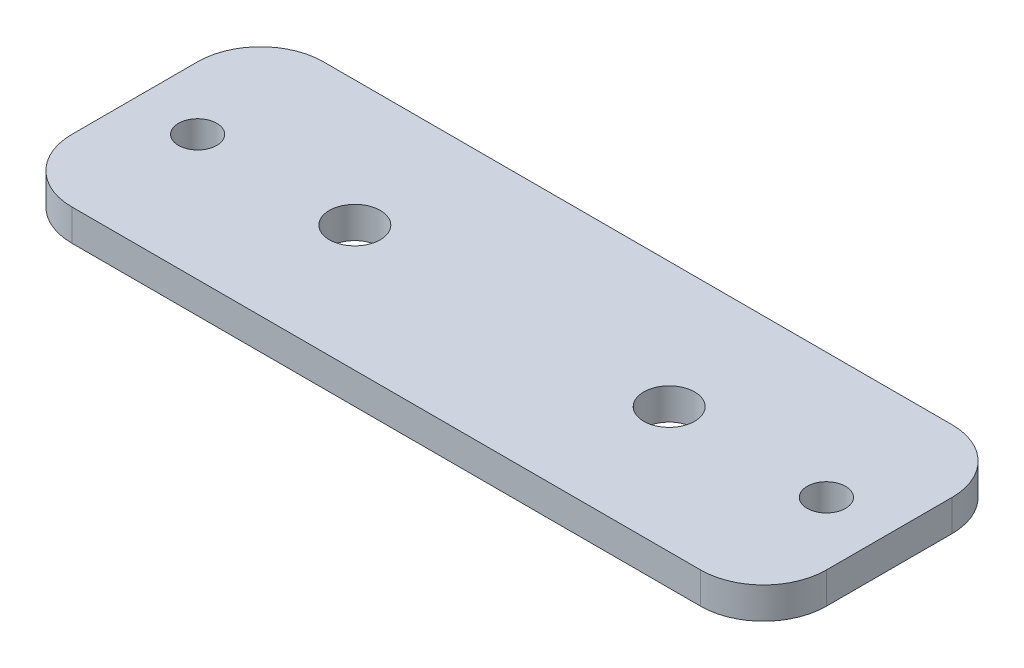
ISO-10303-21;
HEADER;
FILE_DESCRIPTION(('STEP AP214'),'2;1');
FILE_NAME('part.step','',(''),(''),'','','');
FILE_SCHEMA(('AUTOMOTIVE_DESIGN { 1 0 10303 214 1 1 1 1 }'));
ENDSEC;
DATA;
#1=APPLICATION_CONTEXT('core data for automotive mechanical design processes');
#2=APPLICATION_PROTOCOL_DEFINITION('international standard','automotive_design',2000,#1);
#3=PRODUCT_CONTEXT('',#1,'mechanical');
#4=PRODUCT('Part','Part','',(#3));
#5=PRODUCT_RELATED_PRODUCT_CATEGORY('part','',(#4));
#6=PRODUCT_DEFINITION_FORMATION('','',#4);
#7=PRODUCT_DEFINITION_CONTEXT('part definition',#1,'design');
#8=PRODUCT_DEFINITION('design','',#6,#7);
#9=PRODUCT_DEFINITION_SHAPE('','',#8);
#10=(LENGTH_UNIT() NAMED_UNIT(*) SI_UNIT(.MILLI.,.METRE.));
#11=(NAMED_UNIT(*) PLANE_ANGLE_UNIT() SI_UNIT($,.RADIAN.));
#12=(NAMED_UNIT(*) SI_UNIT($,.STERADIAN.) SOLID_ANGLE_UNIT());
#13=UNCERTAINTY_MEASURE_WITH_UNIT(LENGTH_MEASURE(1.E-05),#10,'distance_accuracy_value','');
#14=(GEOMETRIC_REPRESENTATION_CONTEXT(3) GLOBAL_UNCERTAINTY_ASSIGNED_CONTEXT((#13)) GLOBAL_UNIT_ASSIGNED_CONTEXT((#10,
#11,#12)) REPRESENTATION_CONTEXT('',''));
#15=CARTESIAN_POINT('',(0.,0.,0.));
#16=DIRECTION('',(0.,0.,1.));
#17=DIRECTION('',(1.,0.,0.));
#18=AXIS2_PLACEMENT_3D('',#15,#16,#17);
#19=CARTESIAN_POINT('',(60.,5.,-20.));
#20=DIRECTION('',(-1.,0.,0.));
#21=DIRECTION('',(0.,0.,1.));
#22=AXIS2_PLACEMENT_3D('',#19,#20,#21);
#23=PLANE('',#22);
#24=DIRECTION('',(0.,0.,-1.));
#25=VECTOR('',#24,1.);
#26=CARTESIAN_POINT('',(60.,0.,-20.));
#27=LINE('',#26,#25);
#28=CARTESIAN_POINT('',(60.,0.,10.));
#29=VERTEX_POINT('',#28);
#30=CARTESIAN_POINT('',(60.,0.,-10.));
#31=VERTEX_POINT('',#30);
#32=EDGE_CURVE('E138',#29,#31,#27,.T.);
#33=ORIENTED_EDGE('',*,*,#32,.T.);
#34=DIRECTION('',(0.,-1.,0.));
#35=VECTOR('',#34,1.);
#36=CARTESIAN_POINT('',(60.,5.,-10.));
#37=LINE('',#36,#35);
#38=CARTESIAN_POINT('',(60.,5.,-10.));
#39=VERTEX_POINT('',#38);
#40=EDGE_CURVE('E112',#31,#39,#37,.F.);
#41=ORIENTED_EDGE('',*,*,#40,.T.);
#42=DIRECTION('',(0.,0.,-1.));
#43=VECTOR('',#42,1.);
#44=CARTESIAN_POINT('',(60.,5.,-20.));
#45=LINE('',#44,#43);
#46=CARTESIAN_POINT('',(60.,5.,10.));
#47=VERTEX_POINT('',#46);
#48=EDGE_CURVE('E151',#47,#39,#45,.T.);
#49=ORIENTED_EDGE('',*,*,#48,.F.);
#50=DIRECTION('',(0.,-1.,0.));
#51=VECTOR('',#50,1.);
#52=CARTESIAN_POINT('',(60.,5.,10.));
#53=LINE('',#52,#51);
#54=EDGE_CURVE('E118',#47,#29,#53,.T.);
#55=ORIENTED_EDGE('',*,*,#54,.T.);
#56=EDGE_LOOP('',(#33,#41,#49,#55));
#57=FACE_BOUND('',#56,.T.);
#58=ADVANCED_FACE('F39',(#57),#23,.F.);
#59=CARTESIAN_POINT('',(-60.,5.,-20.));
#60=DIRECTION('',(0.,0.,1.));
#61=DIRECTION('',(1.,0.,0.));
#62=AXIS2_PLACEMENT_3D('',#59,#60,#61);
#63=PLANE('',#62);
#64=DIRECTION('',(-1.,0.,0.));
#65=VECTOR('',#64,1.);
#66=CARTESIAN_POINT('',(-60.,5.,-20.));
#67=LINE('',#66,#65);
#68=CARTESIAN_POINT('',(50.,5.,-20.));
#69=VERTEX_POINT('',#68);
#70=CARTESIAN_POINT('',(-50.,5.,-20.));
#71=VERTEX_POINT('',#70);
#72=EDGE_CURVE('E128',#69,#71,#67,.T.);
#73=ORIENTED_EDGE('',*,*,#72,.F.);
#74=DIRECTION('',(0.,-1.,0.));
#75=VECTOR('',#74,1.);
#76=CARTESIAN_POINT('',(50.,5.,-20.));
#77=LINE('',#76,#75);
#78=CARTESIAN_POINT('',(50.,0.,-20.));
#79=VERTEX_POINT('',#78);
#80=EDGE_CURVE('E111',#69,#79,#77,.T.);
#81=ORIENTED_EDGE('',*,*,#80,.T.);
#82=DIRECTION('',(-1.,0.,0.));
#83=VECTOR('',#82,1.);
#84=CARTESIAN_POINT('',(-60.,0.,-20.));
#85=LINE('',#84,#83);
#86=CARTESIAN_POINT('',(-50.,0.,-20.));
#87=VERTEX_POINT('',#86);
#88=EDGE_CURVE('E125',#79,#87,#85,.T.);
#89=ORIENTED_EDGE('',*,*,#88,.T.);
#90=DIRECTION('',(0.,-1.,0.));
#91=VECTOR('',#90,1.);
#92=CARTESIAN_POINT('',(-50.,5.,-20.));
#93=LINE('',#92,#91);
#94=EDGE_CURVE('E131',#87,#71,#93,.F.);
#95=ORIENTED_EDGE('',*,*,#94,.T.);
#96=EDGE_LOOP('',(#73,#81,#89,#95));
#97=FACE_BOUND('',#96,.T.);
#98=ADVANCED_FACE('F124',(#97),#63,.F.);
#99=CARTESIAN_POINT('',(-60.,5.,-20.));
#100=DIRECTION('',(1.,0.,0.));
#101=DIRECTION('',(0.,0.,-1.));
#102=AXIS2_PLACEMENT_3D('',#99,#100,#101);
#103=PLANE('',#102);
#104=DIRECTION('',(0.,0.,1.));
#105=VECTOR('',#104,1.);
#106=CARTESIAN_POINT('',(-60.,5.,-20.));
#107=LINE('',#106,#105);
#108=CARTESIAN_POINT('',(-60.,5.,-10.));
#109=VERTEX_POINT('',#108);
#110=CARTESIAN_POINT('',(-60.,5.,10.));
#111=VERTEX_POINT('',#110);
#112=EDGE_CURVE('E187',#109,#111,#107,.T.);
#113=ORIENTED_EDGE('',*,*,#112,.F.);
#114=DIRECTION('',(0.,-1.,0.));
#115=VECTOR('',#114,1.);
#116=CARTESIAN_POINT('',(-60.,5.,-10.));
#117=LINE('',#116,#115);
#118=CARTESIAN_POINT('',(-60.,0.,-10.));
#119=VERTEX_POINT('',#118);
#120=EDGE_CURVE('E11',#109,#119,#117,.T.);
#121=ORIENTED_EDGE('',*,*,#120,.T.);
#122=DIRECTION('',(0.,0.,1.));
#123=VECTOR('',#122,1.);
#124=CARTESIAN_POINT('',(-60.,0.,-20.));
#125=LINE('',#124,#123);
#126=CARTESIAN_POINT('',(-60.,0.,10.));
#127=VERTEX_POINT('',#126);
#128=EDGE_CURVE('E137',#119,#127,#125,.T.);
#129=ORIENTED_EDGE('',*,*,#128,.T.);
#130=DIRECTION('',(0.,-1.,0.));
#131=VECTOR('',#130,1.);
#132=CARTESIAN_POINT('',(-60.,5.,10.));
#133=LINE('',#132,#131);
#134=EDGE_CURVE('E48',#127,#111,#133,.F.);
#135=ORIENTED_EDGE('',*,*,#134,.T.);
#136=EDGE_LOOP('',(#113,#121,#129,#135));
#137=FACE_BOUND('',#136,.T.);
#138=ADVANCED_FACE('F186',(#137),#103,.F.);
#139=CARTESIAN_POINT('',(-60.,5.,20.));
#140=DIRECTION('',(0.,0.,-1.));
#141=DIRECTION('',(-1.,0.,0.));
#142=AXIS2_PLACEMENT_3D('',#139,#140,#141);
#143=PLANE('',#142);
#144=DIRECTION('',(1.,0.,0.));
#145=VECTOR('',#144,1.);
#146=CARTESIAN_POINT('',(-60.,0.,20.));
#147=LINE('',#146,#145);
#148=CARTESIAN_POINT('',(-50.,0.,20.));
#149=VERTEX_POINT('',#148);
#150=CARTESIAN_POINT('',(50.,0.,20.));
#151=VERTEX_POINT('',#150);
#152=EDGE_CURVE('E143',#149,#151,#147,.T.);
#153=ORIENTED_EDGE('',*,*,#152,.T.);
#154=DIRECTION('',(0.,-1.,0.));
#155=VECTOR('',#154,1.);
#156=CARTESIAN_POINT('',(50.,5.,20.));
#157=LINE('',#156,#155);
#158=CARTESIAN_POINT('',(50.,5.,20.));
#159=VERTEX_POINT('',#158);
#160=EDGE_CURVE('E55',#151,#159,#157,.F.);
#161=ORIENTED_EDGE('',*,*,#160,.T.);
#162=DIRECTION('',(1.,0.,0.));
#163=VECTOR('',#162,1.);
#164=CARTESIAN_POINT('',(-60.,5.,20.));
#165=LINE('',#164,#163);
#166=CARTESIAN_POINT('',(-50.,5.,20.));
#167=VERTEX_POINT('',#166);
#168=EDGE_CURVE('E153',#167,#159,#165,.T.);
#169=ORIENTED_EDGE('',*,*,#168,.F.);
#170=DIRECTION('',(0.,-1.,0.));
#171=VECTOR('',#170,1.);
#172=CARTESIAN_POINT('',(-50.,5.,20.));
#173=LINE('',#172,#171);
#174=EDGE_CURVE('E177',#167,#149,#173,.T.);
#175=ORIENTED_EDGE('',*,*,#174,.T.);
#176=EDGE_LOOP('',(#153,#161,#169,#175));
#177=FACE_BOUND('',#176,.T.);
#178=ADVANCED_FACE('F197',(#177),#143,.F.);
#179=CARTESIAN_POINT('',(0.,5.,0.));
#180=DIRECTION('',(0.,1.,0.));
#181=DIRECTION('',(0.,0.,1.));
#182=AXIS2_PLACEMENT_3D('',#179,#180,#181);
#183=PLANE('',#182);
#184=CARTESIAN_POINT('',(25.,5.,0.));
#185=DIRECTION('',(0.,-1.,0.));
#186=DIRECTION('',(0.,0.,1.));
#187=AXIS2_PLACEMENT_3D('',#184,#185,#186);
#188=CIRCLE('',#187,4.05);
#189=CARTESIAN_POINT('',(25.,5.,4.05));
#190=VERTEX_POINT('',#189);
#191=EDGE_CURVE('E234',#190,#190,#188,.T.);
#192=ORIENTED_EDGE('',*,*,#191,.T.);
#193=EDGE_LOOP('',(#192));
#194=FACE_BOUND('',#193,.T.);
#195=CARTESIAN_POINT('',(50.,5.,0.));
#196=DIRECTION('',(0.,-1.,0.));
#197=DIRECTION('',(0.,0.,1.));
#198=AXIS2_PLACEMENT_3D('',#195,#196,#197);
#199=CIRCLE('',#198,3.05);
#200=CARTESIAN_POINT('',(50.,5.,3.05));
#201=VERTEX_POINT('',#200);
#202=EDGE_CURVE('E226',#201,#201,#199,.T.);
#203=ORIENTED_EDGE('',*,*,#202,.T.);
#204=EDGE_LOOP('',(#203));
#205=FACE_BOUND('',#204,.T.);
#206=CARTESIAN_POINT('',(-25.,5.,0.));
#207=DIRECTION('',(0.,1.,0.));
#208=DIRECTION('',(0.,0.,1.));
#209=AXIS2_PLACEMENT_3D('',#206,#207,#208);
#210=CIRCLE('',#209,4.05);
#211=CARTESIAN_POINT('',(-25.,5.,4.05));
#212=VERTEX_POINT('',#211);
#213=EDGE_CURVE('E219',#212,#212,#210,.T.);
#214=ORIENTED_EDGE('',*,*,#213,.F.);
#215=EDGE_LOOP('',(#214));
#216=FACE_BOUND('',#215,.T.);
#217=CARTESIAN_POINT('',(-50.,5.,0.));
#218=DIRECTION('',(0.,1.,0.));
#219=DIRECTION('',(0.,0.,1.));
#220=AXIS2_PLACEMENT_3D('',#217,#218,#219);
#221=CIRCLE('',#220,3.05);
#222=CARTESIAN_POINT('',(-50.,5.,3.05));
#223=VERTEX_POINT('',#222);
#224=EDGE_CURVE('E214',#223,#223,#221,.T.);
#225=ORIENTED_EDGE('',*,*,#224,.F.);
#226=EDGE_LOOP('',(#225));
#227=FACE_BOUND('',#226,.T.);
#228=ORIENTED_EDGE('',*,*,#48,.T.);
#229=CARTESIAN_POINT('',(50.,5.,-10.));
#230=DIRECTION('',(0.,1.,0.));
#231=DIRECTION('',(0.,0.,1.));
#232=AXIS2_PLACEMENT_3D('',#229,#230,#231);
#233=CIRCLE('',#232,10.);
#234=EDGE_CURVE('E174',#39,#69,#233,.T.);
#235=ORIENTED_EDGE('',*,*,#234,.T.);
#236=ORIENTED_EDGE('',*,*,#72,.T.);
#237=CARTESIAN_POINT('',(-50.,5.,-10.));
#238=DIRECTION('',(0.,1.,0.));
#239=DIRECTION('',(0.,0.,1.));
#240=AXIS2_PLACEMENT_3D('',#237,#238,#239);
#241=CIRCLE('',#240,10.);
#242=EDGE_CURVE('E168',#71,#109,#241,.T.);
#243=ORIENTED_EDGE('',*,*,#242,.T.);
#244=ORIENTED_EDGE('',*,*,#112,.T.);
#245=CARTESIAN_POINT('',(-50.,5.,10.));
#246=DIRECTION('',(0.,1.,0.));
#247=DIRECTION('',(0.,0.,1.));
#248=AXIS2_PLACEMENT_3D('',#245,#246,#247);
#249=CIRCLE('',#248,10.);
#250=EDGE_CURVE('E62',#111,#167,#249,.T.);
#251=ORIENTED_EDGE('',*,*,#250,.T.);
#252=ORIENTED_EDGE('',*,*,#168,.T.);
#253=CARTESIAN_POINT('',(50.,5.,10.));
#254=DIRECTION('',(0.,1.,0.));
#255=DIRECTION('',(0.,0.,1.));
#256=AXIS2_PLACEMENT_3D('',#253,#254,#255);
#257=CIRCLE('',#256,10.);
#258=EDGE_CURVE('E171',#159,#47,#257,.T.);
#259=ORIENTED_EDGE('',*,*,#258,.T.);
#260=EDGE_LOOP('',(#228,#235,#236,#243,#244,#251,#252,#259));
#261=FACE_BOUND('',#260,.T.);
#262=ADVANCED_FACE('F191',(#194,#205,#216,#227,#261),#183,.T.);
#263=CARTESIAN_POINT('',(0.,0.,0.));
#264=DIRECTION('',(0.,1.,0.));
#265=DIRECTION('',(0.,0.,1.));
#266=AXIS2_PLACEMENT_3D('',#263,#264,#265);
#267=PLANE('',#266);
#268=CARTESIAN_POINT('',(25.,0.,0.));
#269=DIRECTION('',(0.,-1.,0.));
#270=DIRECTION('',(0.,0.,1.));
#271=AXIS2_PLACEMENT_3D('',#268,#269,#270);
#272=CIRCLE('',#271,4.05);
#273=CARTESIAN_POINT('',(25.,0.,4.05));
#274=VERTEX_POINT('',#273);
#275=EDGE_CURVE('E215',#274,#274,#272,.T.);
#276=ORIENTED_EDGE('',*,*,#275,.F.);
#277=EDGE_LOOP('',(#276));
#278=FACE_BOUND('',#277,.T.);
#279=CARTESIAN_POINT('',(50.,0.,0.));
#280=DIRECTION('',(0.,-1.,0.));
#281=DIRECTION('',(0.,0.,1.));
#282=AXIS2_PLACEMENT_3D('',#279,#280,#281);
#283=CIRCLE('',#282,3.05);
#284=CARTESIAN_POINT('',(50.,0.,3.05));
#285=VERTEX_POINT('',#284);
#286=EDGE_CURVE('E230',#285,#285,#283,.T.);
#287=ORIENTED_EDGE('',*,*,#286,.F.);
#288=EDGE_LOOP('',(#287));
#289=FACE_BOUND('',#288,.T.);
#290=CARTESIAN_POINT('',(-25.,0.,0.));
#291=DIRECTION('',(0.,1.,0.));
#292=DIRECTION('',(0.,0.,1.));
#293=AXIS2_PLACEMENT_3D('',#290,#291,#292);
#294=CIRCLE('',#293,4.05);
#295=CARTESIAN_POINT('',(-25.,0.,4.05));
#296=VERTEX_POINT('',#295);
#297=EDGE_CURVE('E145',#296,#296,#294,.T.);
#298=ORIENTED_EDGE('',*,*,#297,.T.);
#299=EDGE_LOOP('',(#298));
#300=FACE_BOUND('',#299,.T.);
#301=CARTESIAN_POINT('',(-50.,0.,0.));
#302=DIRECTION('',(0.,1.,0.));
#303=DIRECTION('',(0.,0.,1.));
#304=AXIS2_PLACEMENT_3D('',#301,#302,#303);
#305=CIRCLE('',#304,3.05);
#306=CARTESIAN_POINT('',(-50.,0.,3.05));
#307=VERTEX_POINT('',#306);
#308=EDGE_CURVE('E209',#307,#307,#305,.T.);
#309=ORIENTED_EDGE('',*,*,#308,.T.);
#310=EDGE_LOOP('',(#309));
#311=FACE_BOUND('',#310,.T.);
#312=ORIENTED_EDGE('',*,*,#88,.F.);
#313=CARTESIAN_POINT('',(50.,0.,-10.));
#314=DIRECTION('',(0.,1.,0.));
#315=DIRECTION('',(0.,0.,1.));
#316=AXIS2_PLACEMENT_3D('',#313,#314,#315);
#317=CIRCLE('',#316,10.);
#318=EDGE_CURVE('E107',#79,#31,#317,.F.);
#319=ORIENTED_EDGE('',*,*,#318,.T.);
#320=ORIENTED_EDGE('',*,*,#32,.F.);
#321=CARTESIAN_POINT('',(50.,0.,10.));
#322=DIRECTION('',(0.,1.,0.));
#323=DIRECTION('',(0.,0.,1.));
#324=AXIS2_PLACEMENT_3D('',#321,#322,#323);
#325=CIRCLE('',#324,10.);
#326=EDGE_CURVE('E119',#29,#151,#325,.F.);
#327=ORIENTED_EDGE('',*,*,#326,.T.);
#328=ORIENTED_EDGE('',*,*,#152,.F.);
#329=CARTESIAN_POINT('',(-50.,0.,10.));
#330=DIRECTION('',(0.,1.,0.));
#331=DIRECTION('',(0.,0.,1.));
#332=AXIS2_PLACEMENT_3D('',#329,#330,#331);
#333=CIRCLE('',#332,10.);
#334=EDGE_CURVE('E130',#149,#127,#333,.F.);
#335=ORIENTED_EDGE('',*,*,#334,.T.);
#336=ORIENTED_EDGE('',*,*,#128,.F.);
#337=CARTESIAN_POINT('',(-50.,0.,-10.));
#338=DIRECTION('',(0.,1.,0.));
#339=DIRECTION('',(0.,0.,1.));
#340=AXIS2_PLACEMENT_3D('',#337,#338,#339);
#341=CIRCLE('',#340,10.);
#342=EDGE_CURVE('E135',#119,#87,#341,.F.);
#343=ORIENTED_EDGE('',*,*,#342,.T.);
#344=EDGE_LOOP('',(#312,#319,#320,#327,#328,#335,#336,#343));
#345=FACE_BOUND('',#344,.T.);
#346=ADVANCED_FACE('F133',(#278,#289,#300,#311,#345),#267,.F.);
#347=CARTESIAN_POINT('',(-50.,0.,0.));
#348=DIRECTION('',(0.,1.,0.));
#349=DIRECTION('',(0.,0.,1.));
#350=AXIS2_PLACEMENT_3D('',#347,#348,#349);
#351=CYLINDRICAL_SURFACE('',#350,3.05);
#352=ORIENTED_EDGE('',*,*,#308,.F.);
#353=EDGE_LOOP('',(#352));
#354=FACE_BOUND('',#353,.T.);
#355=ORIENTED_EDGE('',*,*,#224,.T.);
#356=EDGE_LOOP('',(#355));
#357=FACE_BOUND('',#356,.T.);
#358=ADVANCED_FACE('F247',(#354,#357),#351,.F.);
#359=CARTESIAN_POINT('',(-25.,0.,0.));
#360=DIRECTION('',(0.,1.,0.));
#361=DIRECTION('',(0.,0.,1.));
#362=AXIS2_PLACEMENT_3D('',#359,#360,#361);
#363=CYLINDRICAL_SURFACE('',#362,4.05);
#364=ORIENTED_EDGE('',*,*,#297,.F.);
#365=EDGE_LOOP('',(#364));
#366=FACE_BOUND('',#365,.T.);
#367=ORIENTED_EDGE('',*,*,#213,.T.);
#368=EDGE_LOOP('',(#367));
#369=FACE_BOUND('',#368,.T.);
#370=ADVANCED_FACE('F257',(#366,#369),#363,.F.);
#371=CARTESIAN_POINT('',(50.,0.,0.));
#372=DIRECTION('',(0.,1.,0.));
#373=DIRECTION('',(0.,0.,1.));
#374=AXIS2_PLACEMENT_3D('',#371,#372,#373);
#375=CYLINDRICAL_SURFACE('',#374,3.05);
#376=ORIENTED_EDGE('',*,*,#286,.T.);
#377=EDGE_LOOP('',(#376));
#378=FACE_BOUND('',#377,.T.);
#379=ORIENTED_EDGE('',*,*,#202,.F.);
#380=EDGE_LOOP('',(#379));
#381=FACE_BOUND('',#380,.T.);
#382=ADVANCED_FACE('F347',(#378,#381),#375,.F.);
#383=CARTESIAN_POINT('',(25.,0.,0.));
#384=DIRECTION('',(0.,1.,0.));
#385=DIRECTION('',(0.,0.,1.));
#386=AXIS2_PLACEMENT_3D('',#383,#384,#385);
#387=CYLINDRICAL_SURFACE('',#386,4.05);
#388=ORIENTED_EDGE('',*,*,#275,.T.);
#389=EDGE_LOOP('',(#388));
#390=FACE_BOUND('',#389,.T.);
#391=ORIENTED_EDGE('',*,*,#191,.F.);
#392=EDGE_LOOP('',(#391));
#393=FACE_BOUND('',#392,.T.);
#394=ADVANCED_FACE('F242',(#390,#393),#387,.F.);
#395=CARTESIAN_POINT('',(50.,5.,-10.));
#396=DIRECTION('',(0.,-1.,0.));
#397=DIRECTION('',(0.,0.,-1.));
#398=AXIS2_PLACEMENT_3D('',#395,#396,#397);
#399=CYLINDRICAL_SURFACE('',#398,10.);
#400=ORIENTED_EDGE('',*,*,#234,.F.);
#401=ORIENTED_EDGE('',*,*,#40,.F.);
#402=ORIENTED_EDGE('',*,*,#318,.F.);
#403=ORIENTED_EDGE('',*,*,#80,.F.);
#404=EDGE_LOOP('',(#400,#401,#402,#403));
#405=FACE_BOUND('',#404,.T.);
#406=ADVANCED_FACE('F110',(#405),#399,.T.);
#407=CARTESIAN_POINT('',(50.,5.,10.));
#408=DIRECTION('',(0.,-1.,0.));
#409=DIRECTION('',(0.,0.,-1.));
#410=AXIS2_PLACEMENT_3D('',#407,#408,#409);
#411=CYLINDRICAL_SURFACE('',#410,10.);
#412=ORIENTED_EDGE('',*,*,#258,.F.);
#413=ORIENTED_EDGE('',*,*,#160,.F.);
#414=ORIENTED_EDGE('',*,*,#326,.F.);
#415=ORIENTED_EDGE('',*,*,#54,.F.);
#416=EDGE_LOOP('',(#412,#413,#414,#415));
#417=FACE_BOUND('',#416,.T.);
#418=ADVANCED_FACE('F201',(#417),#411,.T.);
#419=CARTESIAN_POINT('',(-50.,5.,-10.));
#420=DIRECTION('',(0.,-1.,0.));
#421=DIRECTION('',(0.,0.,-1.));
#422=AXIS2_PLACEMENT_3D('',#419,#420,#421);
#423=CYLINDRICAL_SURFACE('',#422,10.);
#424=ORIENTED_EDGE('',*,*,#242,.F.);
#425=ORIENTED_EDGE('',*,*,#94,.F.);
#426=ORIENTED_EDGE('',*,*,#342,.F.);
#427=ORIENTED_EDGE('',*,*,#120,.F.);
#428=EDGE_LOOP('',(#424,#425,#426,#427));
#429=FACE_BOUND('',#428,.T.);
#430=ADVANCED_FACE('F280',(#429),#423,.T.);
#431=CARTESIAN_POINT('',(-50.,5.,10.));
#432=DIRECTION('',(0.,-1.,0.));
#433=DIRECTION('',(0.,0.,-1.));
#434=AXIS2_PLACEMENT_3D('',#431,#432,#433);
#435=CYLINDRICAL_SURFACE('',#434,10.);
#436=ORIENTED_EDGE('',*,*,#250,.F.);
#437=ORIENTED_EDGE('',*,*,#134,.F.);
#438=ORIENTED_EDGE('',*,*,#334,.F.);
#439=ORIENTED_EDGE('',*,*,#174,.F.);
#440=EDGE_LOOP('',(#436,#437,#438,#439));
#441=FACE_BOUND('',#440,.T.);
#442=ADVANCED_FACE('F41',(#441),#435,.T.);
#443=CLOSED_SHELL('',(#58,#98,#138,#178,#262,#346,#358,#370,#382,#394,#406,#418,#430,#442));
#444=MANIFOLD_SOLID_BREP('B2',#443);
#445=ADVANCED_BREP_SHAPE_REPRESENTATION('',(#18,#444),#14);
#446=SHAPE_DEFINITION_REPRESENTATION(#9,#445);
ENDSEC;
END-ISO-10303-21;
